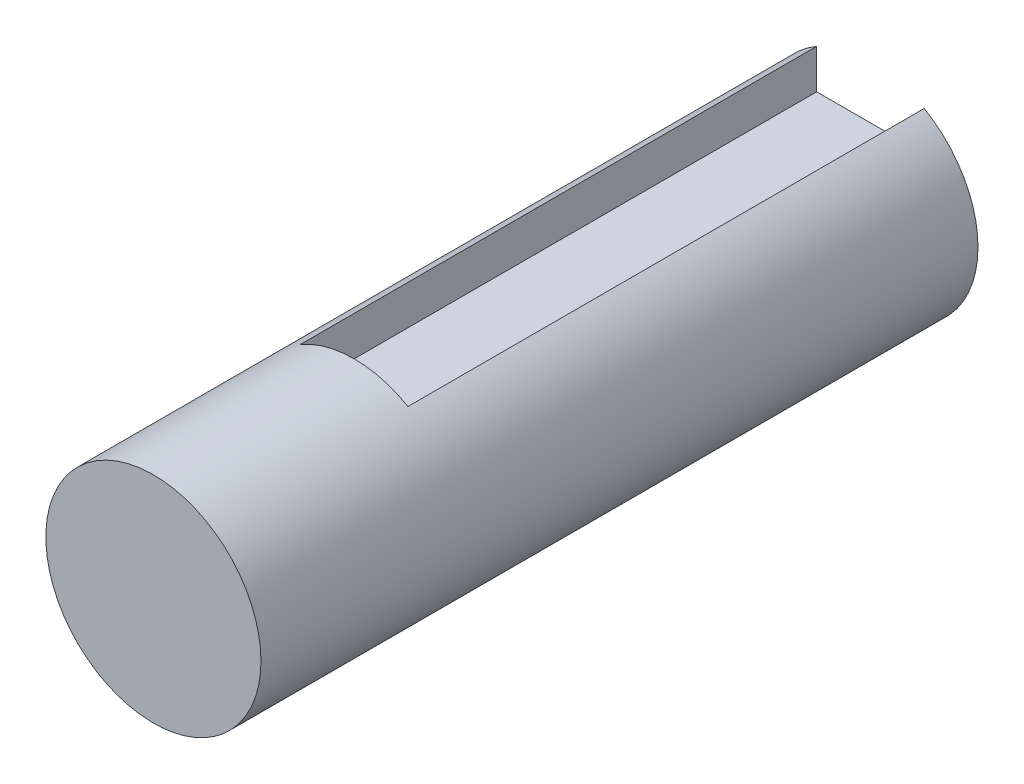
ISO-10303-21;
HEADER;
FILE_DESCRIPTION(('STEP AP214'),'2;1');
FILE_NAME('part.step','',(''),(''),'','','');
FILE_SCHEMA(('AUTOMOTIVE_DESIGN { 1 0 10303 214 1 1 1 1 }'));
ENDSEC;
DATA;
#1=APPLICATION_CONTEXT('core data for automotive mechanical design processes');
#2=APPLICATION_PROTOCOL_DEFINITION('international standard','automotive_design',2000,#1);
#3=PRODUCT_CONTEXT('',#1,'mechanical');
#4=PRODUCT('Part','Part','',(#3));
#5=PRODUCT_RELATED_PRODUCT_CATEGORY('part','',(#4));
#6=PRODUCT_DEFINITION_FORMATION('','',#4);
#7=PRODUCT_DEFINITION_CONTEXT('part definition',#1,'design');
#8=PRODUCT_DEFINITION('design','',#6,#7);
#9=PRODUCT_DEFINITION_SHAPE('','',#8);
#10=(LENGTH_UNIT() NAMED_UNIT(*) SI_UNIT(.MILLI.,.METRE.));
#11=(NAMED_UNIT(*) PLANE_ANGLE_UNIT() SI_UNIT($,.RADIAN.));
#12=(NAMED_UNIT(*) SI_UNIT($,.STERADIAN.) SOLID_ANGLE_UNIT());
#13=UNCERTAINTY_MEASURE_WITH_UNIT(LENGTH_MEASURE(1.E-05),#10,'distance_accuracy_value','');
#14=(GEOMETRIC_REPRESENTATION_CONTEXT(3) GLOBAL_UNCERTAINTY_ASSIGNED_CONTEXT((#13)) GLOBAL_UNIT_ASSIGNED_CONTEXT((#10,
#11,#12)) REPRESENTATION_CONTEXT('',''));
#15=CARTESIAN_POINT('',(0.,0.,0.));
#16=DIRECTION('',(0.,0.,1.));
#17=DIRECTION('',(1.,0.,0.));
#18=AXIS2_PLACEMENT_3D('',#15,#16,#17);
#19=CARTESIAN_POINT('',(0.,0.,-72.));
#20=DIRECTION('',(0.,0.,1.));
#21=DIRECTION('',(1.,0.,0.));
#22=AXIS2_PLACEMENT_3D('',#19,#20,#21);
#23=CYLINDRICAL_SURFACE('',#22,15.);
#24=DIRECTION('',(0.,0.,-1.));
#25=VECTOR('',#24,1.);
#26=CARTESIAN_POINT('',(-7.5,12.9903810567666,0.));
#27=LINE('',#26,#25);
#28=CARTESIAN_POINT('',(-7.5,12.9903810567666,0.));
#29=VERTEX_POINT('',#28);
#30=CARTESIAN_POINT('',(-7.5,12.9903810567666,-72.));
#31=VERTEX_POINT('',#30);
#32=EDGE_CURVE('E67',#29,#31,#27,.T.);
#33=ORIENTED_EDGE('',*,*,#32,.T.);
#34=CARTESIAN_POINT('',(0.,0.,-72.));
#35=DIRECTION('',(0.,0.,1.));
#36=DIRECTION('',(1.,0.,0.));
#37=AXIS2_PLACEMENT_3D('',#34,#35,#36);
#38=CIRCLE('',#37,15.);
#39=CARTESIAN_POINT('',(7.5,12.9903810567666,-72.));
#40=VERTEX_POINT('',#39);
#41=EDGE_CURVE('E11',#31,#40,#38,.T.);
#42=ORIENTED_EDGE('',*,*,#41,.T.);
#43=DIRECTION('',(0.,0.,-1.));
#44=VECTOR('',#43,1.);
#45=CARTESIAN_POINT('',(7.5,12.9903810567666,0.));
#46=LINE('',#45,#44);
#47=CARTESIAN_POINT('',(7.5,12.9903810567666,0.));
#48=VERTEX_POINT('',#47);
#49=EDGE_CURVE('E58',#48,#40,#46,.T.);
#50=ORIENTED_EDGE('',*,*,#49,.F.);
#51=CARTESIAN_POINT('',(0.,0.,0.));
#52=DIRECTION('',(0.,0.,-1.));
#53=DIRECTION('',(-1.,0.,0.));
#54=AXIS2_PLACEMENT_3D('',#51,#52,#53);
#55=CIRCLE('',#54,15.);
#56=EDGE_CURVE('E107',#29,#48,#55,.T.);
#57=ORIENTED_EDGE('',*,*,#56,.F.);
#58=EDGE_LOOP('',(#33,#42,#50,#57));
#59=FACE_BOUND('',#58,.T.);
#60=CARTESIAN_POINT('',(0.,0.,28.));
#61=DIRECTION('',(0.,0.,1.));
#62=DIRECTION('',(1.,0.,0.));
#63=AXIS2_PLACEMENT_3D('',#60,#61,#62);
#64=CIRCLE('',#63,15.);
#65=CARTESIAN_POINT('',(15.,0.,28.));
#66=VERTEX_POINT('',#65);
#67=EDGE_CURVE('E51',#66,#66,#64,.T.);
#68=ORIENTED_EDGE('',*,*,#67,.F.);
#69=EDGE_LOOP('',(#68));
#70=FACE_BOUND('',#69,.T.);
#71=ADVANCED_FACE('F43',(#59,#70),#23,.T.);
#72=CARTESIAN_POINT('',(15.,0.,-72.));
#73=DIRECTION('',(0.,0.,-1.));
#74=DIRECTION('',(-1.,0.,0.));
#75=AXIS2_PLACEMENT_3D('',#72,#73,#74);
#76=PLANE('',#75);
#77=DIRECTION('',(0.,1.,0.));
#78=VECTOR('',#77,1.);
#79=CARTESIAN_POINT('',(-7.5,7.5,-72.));
#80=LINE('',#79,#78);
#81=CARTESIAN_POINT('',(-7.5,7.5,-72.));
#82=VERTEX_POINT('',#81);
#83=EDGE_CURVE('E82',#82,#31,#80,.T.);
#84=ORIENTED_EDGE('',*,*,#83,.F.);
#85=DIRECTION('',(-1.,0.,0.));
#86=VECTOR('',#85,1.);
#87=CARTESIAN_POINT('',(7.5,7.5,-72.));
#88=LINE('',#87,#86);
#89=CARTESIAN_POINT('',(7.5,7.5,-72.));
#90=VERTEX_POINT('',#89);
#91=EDGE_CURVE('E117',#90,#82,#88,.T.);
#92=ORIENTED_EDGE('',*,*,#91,.F.);
#93=DIRECTION('',(0.,-1.,0.));
#94=VECTOR('',#93,1.);
#95=CARTESIAN_POINT('',(7.5,12.9903810567666,-72.));
#96=LINE('',#95,#94);
#97=EDGE_CURVE('E91',#40,#90,#96,.T.);
#98=ORIENTED_EDGE('',*,*,#97,.F.);
#99=ORIENTED_EDGE('',*,*,#41,.F.);
#100=EDGE_LOOP('',(#84,#92,#98,#99));
#101=FACE_BOUND('',#100,.T.);
#102=ADVANCED_FACE('F134',(#101),#76,.T.);
#103=CARTESIAN_POINT('',(0.,0.,28.));
#104=DIRECTION('',(0.,0.,1.));
#105=DIRECTION('',(1.,0.,0.));
#106=AXIS2_PLACEMENT_3D('',#103,#104,#105);
#107=PLANE('',#106);
#108=ORIENTED_EDGE('',*,*,#67,.T.);
#109=EDGE_LOOP('',(#108));
#110=FACE_BOUND('',#109,.T.);
#111=ADVANCED_FACE('F131',(#110),#107,.T.);
#112=CARTESIAN_POINT('',(-7.5,7.5,0.));
#113=DIRECTION('',(-1.,0.,0.));
#114=DIRECTION('',(0.,0.,1.));
#115=AXIS2_PLACEMENT_3D('',#112,#113,#114);
#116=PLANE('',#115);
#117=ORIENTED_EDGE('',*,*,#83,.T.);
#118=ORIENTED_EDGE('',*,*,#32,.F.);
#119=DIRECTION('',(0.,1.,0.));
#120=VECTOR('',#119,1.);
#121=CARTESIAN_POINT('',(-7.5,7.5,0.));
#122=LINE('',#121,#120);
#123=CARTESIAN_POINT('',(-7.5,7.5,0.));
#124=VERTEX_POINT('',#123);
#125=EDGE_CURVE('E103',#124,#29,#122,.T.);
#126=ORIENTED_EDGE('',*,*,#125,.F.);
#127=DIRECTION('',(0.,0.,-1.));
#128=VECTOR('',#127,1.);
#129=CARTESIAN_POINT('',(-7.5,7.5,0.));
#130=LINE('',#129,#128);
#131=EDGE_CURVE('E96',#124,#82,#130,.T.);
#132=ORIENTED_EDGE('',*,*,#131,.T.);
#133=EDGE_LOOP('',(#117,#118,#126,#132));
#134=FACE_BOUND('',#133,.T.);
#135=ADVANCED_FACE('F144',(#134),#116,.F.);
#136=CARTESIAN_POINT('',(7.5,7.5,0.));
#137=DIRECTION('',(0.,-1.,0.));
#138=DIRECTION('',(0.,0.,-1.));
#139=AXIS2_PLACEMENT_3D('',#136,#137,#138);
#140=PLANE('',#139);
#141=ORIENTED_EDGE('',*,*,#91,.T.);
#142=ORIENTED_EDGE('',*,*,#131,.F.);
#143=DIRECTION('',(-1.,0.,0.));
#144=VECTOR('',#143,1.);
#145=CARTESIAN_POINT('',(7.5,7.5,0.));
#146=LINE('',#145,#144);
#147=CARTESIAN_POINT('',(7.5,7.5,0.));
#148=VERTEX_POINT('',#147);
#149=EDGE_CURVE('E99',#148,#124,#146,.T.);
#150=ORIENTED_EDGE('',*,*,#149,.F.);
#151=DIRECTION('',(0.,0.,-1.));
#152=VECTOR('',#151,1.);
#153=CARTESIAN_POINT('',(7.5,7.5,0.));
#154=LINE('',#153,#152);
#155=EDGE_CURVE('E88',#148,#90,#154,.T.);
#156=ORIENTED_EDGE('',*,*,#155,.T.);
#157=EDGE_LOOP('',(#141,#142,#150,#156));
#158=FACE_BOUND('',#157,.T.);
#159=ADVANCED_FACE('F100',(#158),#140,.F.);
#160=CARTESIAN_POINT('',(7.5,12.9903810567666,0.));
#161=DIRECTION('',(1.,0.,0.));
#162=DIRECTION('',(0.,0.,-1.));
#163=AXIS2_PLACEMENT_3D('',#160,#161,#162);
#164=PLANE('',#163);
#165=ORIENTED_EDGE('',*,*,#97,.T.);
#166=ORIENTED_EDGE('',*,*,#155,.F.);
#167=DIRECTION('',(0.,-1.,0.));
#168=VECTOR('',#167,1.);
#169=CARTESIAN_POINT('',(7.5,12.9903810567666,0.));
#170=LINE('',#169,#168);
#171=EDGE_CURVE('E86',#48,#148,#170,.T.);
#172=ORIENTED_EDGE('',*,*,#171,.F.);
#173=ORIENTED_EDGE('',*,*,#49,.T.);
#174=EDGE_LOOP('',(#165,#166,#172,#173));
#175=FACE_BOUND('',#174,.T.);
#176=ADVANCED_FACE('F90',(#175),#164,.F.);
#177=CARTESIAN_POINT('',(0.,0.,0.));
#178=DIRECTION('',(0.,0.,-1.));
#179=DIRECTION('',(-1.,0.,0.));
#180=AXIS2_PLACEMENT_3D('',#177,#178,#179);
#181=PLANE('',#180);
#182=ORIENTED_EDGE('',*,*,#56,.T.);
#183=ORIENTED_EDGE('',*,*,#171,.T.);
#184=ORIENTED_EDGE('',*,*,#149,.T.);
#185=ORIENTED_EDGE('',*,*,#125,.T.);
#186=EDGE_LOOP('',(#182,#183,#184,#185));
#187=FACE_BOUND('',#186,.T.);
#188=ADVANCED_FACE('F105',(#187),#181,.T.);
#189=CLOSED_SHELL('',(#71,#102,#111,#135,#159,#176,#188));
#190=MANIFOLD_SOLID_BREP('B2',#189);
#191=ADVANCED_BREP_SHAPE_REPRESENTATION('',(#18,#190),#14);
#192=SHAPE_DEFINITION_REPRESENTATION(#9,#191);
ENDSEC;
END-ISO-10303-21;
